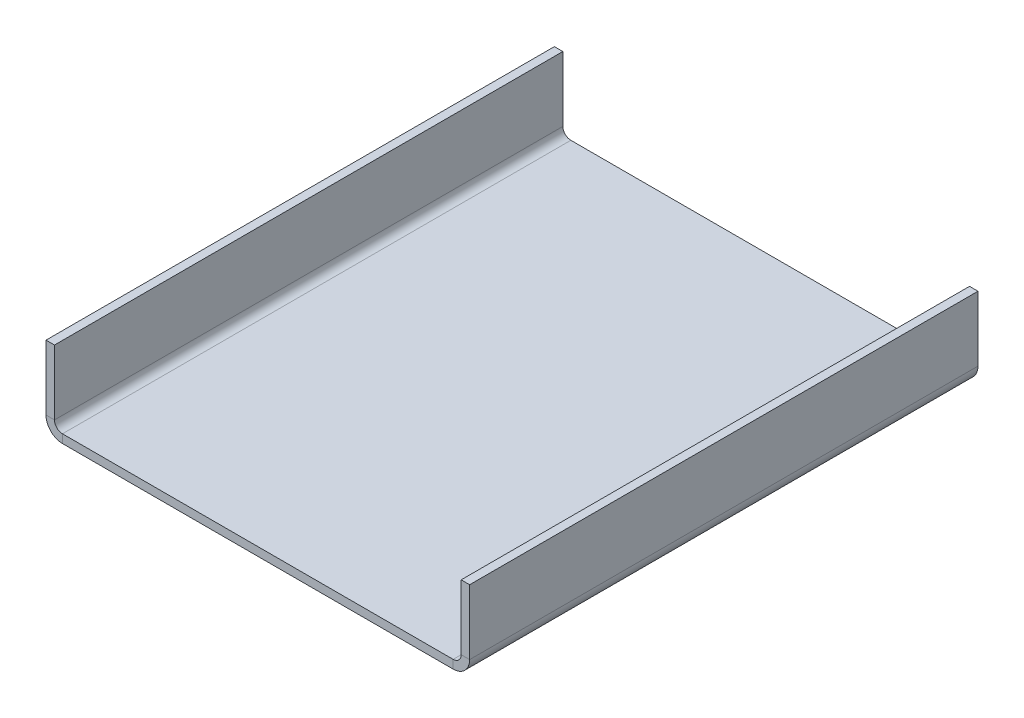
ISO-10303-21;
HEADER;
FILE_DESCRIPTION(('STEP AP214'),'2;1');
FILE_NAME('part.step','',(''),(''),'','','');
FILE_SCHEMA(('AUTOMOTIVE_DESIGN { 1 0 10303 214 1 1 1 1 }'));
ENDSEC;
DATA;
#1=APPLICATION_CONTEXT('core data for automotive mechanical design processes');
#2=APPLICATION_PROTOCOL_DEFINITION('international standard','automotive_design',2000,#1);
#3=PRODUCT_CONTEXT('',#1,'mechanical');
#4=PRODUCT('Part','Part','',(#3));
#5=PRODUCT_RELATED_PRODUCT_CATEGORY('part','',(#4));
#6=PRODUCT_DEFINITION_FORMATION('','',#4);
#7=PRODUCT_DEFINITION_CONTEXT('part definition',#1,'design');
#8=PRODUCT_DEFINITION('design','',#6,#7);
#9=PRODUCT_DEFINITION_SHAPE('','',#8);
#10=(LENGTH_UNIT() NAMED_UNIT(*) SI_UNIT(.MILLI.,.METRE.));
#11=(NAMED_UNIT(*) PLANE_ANGLE_UNIT() SI_UNIT($,.RADIAN.));
#12=(NAMED_UNIT(*) SI_UNIT($,.STERADIAN.) SOLID_ANGLE_UNIT());
#13=UNCERTAINTY_MEASURE_WITH_UNIT(LENGTH_MEASURE(1.E-05),#10,'distance_accuracy_value','');
#14=(GEOMETRIC_REPRESENTATION_CONTEXT(3) GLOBAL_UNCERTAINTY_ASSIGNED_CONTEXT((#13)) GLOBAL_UNIT_ASSIGNED_CONTEXT((#10,
#11,#12)) REPRESENTATION_CONTEXT('',''));
#15=CARTESIAN_POINT('',(0.,0.,0.));
#16=DIRECTION('',(0.,0.,1.));
#17=DIRECTION('',(1.,0.,0.));
#18=AXIS2_PLACEMENT_3D('',#15,#16,#17);
#19=CARTESIAN_POINT('',(-79.375,-9.06500000000001,190.5));
#20=DIRECTION('',(0.,0.,1.));
#21=DIRECTION('',(1.,0.,0.));
#22=AXIS2_PLACEMENT_3D('',#19,#20,#21);
#23=PLANE('',#22);
#24=DIRECTION('',(1.,0.,0.));
#25=VECTOR('',#24,1.);
#26=CARTESIAN_POINT('',(-79.375,-9.06500000000001,190.5));
#27=LINE('',#26,#25);
#28=CARTESIAN_POINT('',(-79.375,-9.06500000000001,190.5));
#29=VERTEX_POINT('',#28);
#30=CARTESIAN_POINT('',(-76.2,-9.06500000000001,190.5));
#31=VERTEX_POINT('',#30);
#32=EDGE_CURVE('E11',#29,#31,#27,.T.);
#33=ORIENTED_EDGE('',*,*,#32,.F.);
#34=CARTESIAN_POINT('',(-73.2,-9.06500000000001,190.5));
#35=DIRECTION('',(0.,0.,-1.));
#36=DIRECTION('',(-1.,0.,0.));
#37=AXIS2_PLACEMENT_3D('',#34,#35,#36);
#38=CIRCLE('',#37,6.175);
#39=CARTESIAN_POINT('',(-73.1999999999999,-15.24,190.5));
#40=VERTEX_POINT('',#39);
#41=EDGE_CURVE('E146',#29,#40,#38,.F.);
#42=ORIENTED_EDGE('',*,*,#41,.T.);
#43=DIRECTION('',(0.,-1.,0.));
#44=VECTOR('',#43,1.);
#45=CARTESIAN_POINT('',(-73.1999999999999,-12.065,190.5));
#46=LINE('',#45,#44);
#47=CARTESIAN_POINT('',(-73.1999999999999,-12.065,190.5));
#48=VERTEX_POINT('',#47);
#49=EDGE_CURVE('E44',#48,#40,#46,.T.);
#50=ORIENTED_EDGE('',*,*,#49,.F.);
#51=CARTESIAN_POINT('',(-73.2,-9.06500000000001,190.5));
#52=DIRECTION('',(0.,0.,1.));
#53=DIRECTION('',(1.,0.,0.));
#54=AXIS2_PLACEMENT_3D('',#51,#52,#53);
#55=CIRCLE('',#54,3.);
#56=EDGE_CURVE('E240',#31,#48,#55,.T.);
#57=ORIENTED_EDGE('',*,*,#56,.F.);
#58=EDGE_LOOP('',(#33,#42,#50,#57));
#59=FACE_BOUND('',#58,.T.);
#60=ADVANCED_FACE('F36',(#59),#23,.T.);
#61=CARTESIAN_POINT('',(-73.1999999999999,-12.065,190.5));
#62=DIRECTION('',(0.,0.,1.));
#63=DIRECTION('',(1.,0.,0.));
#64=AXIS2_PLACEMENT_3D('',#61,#62,#63);
#65=PLANE('',#64);
#66=DIRECTION('',(0.,-1.,0.));
#67=VECTOR('',#66,1.);
#68=CARTESIAN_POINT('',(-79.375,-15.24,190.5));
#69=LINE('',#68,#67);
#70=CARTESIAN_POINT('',(-79.375,15.24,190.5));
#71=VERTEX_POINT('',#70);
#72=EDGE_CURVE('E151',#71,#29,#69,.T.);
#73=ORIENTED_EDGE('',*,*,#72,.T.);
#74=ORIENTED_EDGE('',*,*,#32,.T.);
#75=DIRECTION('',(0.,1.,0.));
#76=VECTOR('',#75,1.);
#77=CARTESIAN_POINT('',(-76.2,-15.24,190.5));
#78=LINE('',#77,#76);
#79=CARTESIAN_POINT('',(-76.2,15.24,190.5));
#80=VERTEX_POINT('',#79);
#81=EDGE_CURVE('E253',#80,#31,#78,.F.);
#82=ORIENTED_EDGE('',*,*,#81,.F.);
#83=DIRECTION('',(1.,0.,0.));
#84=VECTOR('',#83,1.);
#85=CARTESIAN_POINT('',(-79.375,15.24,190.5));
#86=LINE('',#85,#84);
#87=EDGE_CURVE('E255',#71,#80,#86,.T.);
#88=ORIENTED_EDGE('',*,*,#87,.F.);
#89=EDGE_LOOP('',(#73,#74,#82,#88));
#90=FACE_BOUND('',#89,.T.);
#91=ADVANCED_FACE('F266',(#90),#65,.T.);
#92=CARTESIAN_POINT('',(-73.1999999999999,-15.24,0.));
#93=DIRECTION('',(0.,0.,-1.));
#94=DIRECTION('',(-1.,0.,0.));
#95=AXIS2_PLACEMENT_3D('',#92,#93,#94);
#96=PLANE('',#95);
#97=DIRECTION('',(0.,1.,0.));
#98=VECTOR('',#97,1.);
#99=CARTESIAN_POINT('',(-73.1999999999999,-15.24,0.));
#100=LINE('',#99,#98);
#101=CARTESIAN_POINT('',(-73.1999999999999,-15.24,0.));
#102=VERTEX_POINT('',#101);
#103=CARTESIAN_POINT('',(-73.1999999999999,-12.065,0.));
#104=VERTEX_POINT('',#103);
#105=EDGE_CURVE('E144',#102,#104,#100,.T.);
#106=ORIENTED_EDGE('',*,*,#105,.F.);
#107=CARTESIAN_POINT('',(-73.2,-9.06500000000001,0.));
#108=DIRECTION('',(0.,0.,-1.));
#109=DIRECTION('',(-1.,0.,0.));
#110=AXIS2_PLACEMENT_3D('',#107,#108,#109);
#111=CIRCLE('',#110,6.175);
#112=CARTESIAN_POINT('',(-79.375,-9.06500000000001,0.));
#113=VERTEX_POINT('',#112);
#114=EDGE_CURVE('E158',#113,#102,#111,.F.);
#115=ORIENTED_EDGE('',*,*,#114,.F.);
#116=DIRECTION('',(-1.,0.,0.));
#117=VECTOR('',#116,1.);
#118=CARTESIAN_POINT('',(-76.2,-9.06500000000001,0.));
#119=LINE('',#118,#117);
#120=CARTESIAN_POINT('',(-76.2,-9.06500000000001,0.));
#121=VERTEX_POINT('',#120);
#122=EDGE_CURVE('E231',#121,#113,#119,.T.);
#123=ORIENTED_EDGE('',*,*,#122,.F.);
#124=CARTESIAN_POINT('',(-73.2,-9.06500000000001,0.));
#125=DIRECTION('',(0.,0.,1.));
#126=DIRECTION('',(1.,0.,0.));
#127=AXIS2_PLACEMENT_3D('',#124,#125,#126);
#128=CIRCLE('',#127,3.);
#129=EDGE_CURVE('E185',#121,#104,#128,.T.);
#130=ORIENTED_EDGE('',*,*,#129,.T.);
#131=EDGE_LOOP('',(#106,#115,#123,#130));
#132=FACE_BOUND('',#131,.T.);
#133=ADVANCED_FACE('F245',(#132),#96,.T.);
#134=CARTESIAN_POINT('',(-76.2,-9.06500000000001,0.));
#135=DIRECTION('',(0.,0.,-1.));
#136=DIRECTION('',(-1.,0.,0.));
#137=AXIS2_PLACEMENT_3D('',#134,#135,#136);
#138=PLANE('',#137);
#139=DIRECTION('',(1.,0.,0.));
#140=VECTOR('',#139,1.);
#141=CARTESIAN_POINT('',(79.375,-15.24,0.));
#142=LINE('',#141,#140);
#143=CARTESIAN_POINT('',(73.2,-15.24,0.));
#144=VERTEX_POINT('',#143);
#145=EDGE_CURVE('E198',#102,#144,#142,.T.);
#146=ORIENTED_EDGE('',*,*,#145,.F.);
#147=ORIENTED_EDGE('',*,*,#105,.T.);
#148=DIRECTION('',(1.,0.,0.));
#149=VECTOR('',#148,1.);
#150=CARTESIAN_POINT('',(79.375,-12.065,0.));
#151=LINE('',#150,#149);
#152=CARTESIAN_POINT('',(73.2,-12.065,0.));
#153=VERTEX_POINT('',#152);
#154=EDGE_CURVE('E183',#104,#153,#151,.T.);
#155=ORIENTED_EDGE('',*,*,#154,.T.);
#156=DIRECTION('',(0.,-1.,0.));
#157=VECTOR('',#156,1.);
#158=CARTESIAN_POINT('',(73.2,-12.065,0.));
#159=LINE('',#158,#157);
#160=EDGE_CURVE('E93',#153,#144,#159,.T.);
#161=ORIENTED_EDGE('',*,*,#160,.T.);
#162=EDGE_LOOP('',(#146,#147,#155,#161));
#163=FACE_BOUND('',#162,.T.);
#164=ADVANCED_FACE('F233',(#163),#138,.T.);
#165=CARTESIAN_POINT('',(73.2,-15.24,190.5));
#166=DIRECTION('',(0.,0.,1.));
#167=DIRECTION('',(1.,0.,0.));
#168=AXIS2_PLACEMENT_3D('',#165,#166,#167);
#169=PLANE('',#168);
#170=DIRECTION('',(0.,1.,0.));
#171=VECTOR('',#170,1.);
#172=CARTESIAN_POINT('',(73.2,-15.24,190.5));
#173=LINE('',#172,#171);
#174=CARTESIAN_POINT('',(73.2,-15.24,190.5));
#175=VERTEX_POINT('',#174);
#176=CARTESIAN_POINT('',(73.2,-12.065,190.5));
#177=VERTEX_POINT('',#176);
#178=EDGE_CURVE('E229',#175,#177,#173,.T.);
#179=ORIENTED_EDGE('',*,*,#178,.F.);
#180=CARTESIAN_POINT('',(73.2,-9.06499999999999,190.5));
#181=DIRECTION('',(0.,0.,-1.));
#182=DIRECTION('',(-1.,0.,0.));
#183=AXIS2_PLACEMENT_3D('',#180,#181,#182);
#184=CIRCLE('',#183,6.175);
#185=CARTESIAN_POINT('',(79.375,-9.06499999999999,190.5));
#186=VERTEX_POINT('',#185);
#187=EDGE_CURVE('E166',#175,#186,#184,.F.);
#188=ORIENTED_EDGE('',*,*,#187,.T.);
#189=DIRECTION('',(1.,0.,0.));
#190=VECTOR('',#189,1.);
#191=CARTESIAN_POINT('',(76.2,-9.06499999999999,190.5));
#192=LINE('',#191,#190);
#193=CARTESIAN_POINT('',(76.2,-9.06499999999999,190.5));
#194=VERTEX_POINT('',#193);
#195=EDGE_CURVE('E52',#194,#186,#192,.T.);
#196=ORIENTED_EDGE('',*,*,#195,.F.);
#197=CARTESIAN_POINT('',(73.2,-9.06499999999999,190.5));
#198=DIRECTION('',(0.,0.,1.));
#199=DIRECTION('',(1.,0.,0.));
#200=AXIS2_PLACEMENT_3D('',#197,#198,#199);
#201=CIRCLE('',#200,3.);
#202=EDGE_CURVE('E257',#177,#194,#201,.T.);
#203=ORIENTED_EDGE('',*,*,#202,.F.);
#204=EDGE_LOOP('',(#179,#188,#196,#203));
#205=FACE_BOUND('',#204,.T.);
#206=ADVANCED_FACE('F292',(#205),#169,.T.);
#207=CARTESIAN_POINT('',(76.2,-9.06499999999999,190.5));
#208=DIRECTION('',(0.,0.,1.));
#209=DIRECTION('',(1.,0.,0.));
#210=AXIS2_PLACEMENT_3D('',#207,#208,#209);
#211=PLANE('',#210);
#212=DIRECTION('',(1.,0.,0.));
#213=VECTOR('',#212,1.);
#214=CARTESIAN_POINT('',(79.375,-15.24,190.5));
#215=LINE('',#214,#213);
#216=EDGE_CURVE('E136',#40,#175,#215,.T.);
#217=ORIENTED_EDGE('',*,*,#216,.T.);
#218=ORIENTED_EDGE('',*,*,#178,.T.);
#219=DIRECTION('',(1.,0.,0.));
#220=VECTOR('',#219,1.);
#221=CARTESIAN_POINT('',(79.375,-12.065,190.5));
#222=LINE('',#221,#220);
#223=EDGE_CURVE('E139',#48,#177,#222,.T.);
#224=ORIENTED_EDGE('',*,*,#223,.F.);
#225=ORIENTED_EDGE('',*,*,#49,.T.);
#226=EDGE_LOOP('',(#217,#218,#224,#225));
#227=FACE_BOUND('',#226,.T.);
#228=ADVANCED_FACE('F134',(#227),#211,.T.);
#229=CARTESIAN_POINT('',(79.375,-9.06499999999999,0.));
#230=DIRECTION('',(0.,0.,-1.));
#231=DIRECTION('',(-1.,0.,0.));
#232=AXIS2_PLACEMENT_3D('',#229,#230,#231);
#233=PLANE('',#232);
#234=DIRECTION('',(-1.,0.,0.));
#235=VECTOR('',#234,1.);
#236=CARTESIAN_POINT('',(79.375,-9.06499999999999,0.));
#237=LINE('',#236,#235);
#238=CARTESIAN_POINT('',(79.375,-9.06499999999999,0.));
#239=VERTEX_POINT('',#238);
#240=CARTESIAN_POINT('',(76.2,-9.06499999999999,0.));
#241=VERTEX_POINT('',#240);
#242=EDGE_CURVE('E100',#239,#241,#237,.T.);
#243=ORIENTED_EDGE('',*,*,#242,.F.);
#244=CARTESIAN_POINT('',(73.2,-9.06499999999999,0.));
#245=DIRECTION('',(0.,0.,-1.));
#246=DIRECTION('',(-1.,0.,0.));
#247=AXIS2_PLACEMENT_3D('',#244,#245,#246);
#248=CIRCLE('',#247,6.175);
#249=EDGE_CURVE('E200',#144,#239,#248,.F.);
#250=ORIENTED_EDGE('',*,*,#249,.F.);
#251=ORIENTED_EDGE('',*,*,#160,.F.);
#252=CARTESIAN_POINT('',(73.2,-9.06499999999999,0.));
#253=DIRECTION('',(0.,0.,1.));
#254=DIRECTION('',(1.,0.,0.));
#255=AXIS2_PLACEMENT_3D('',#252,#253,#254);
#256=CIRCLE('',#255,3.);
#257=EDGE_CURVE('E181',#153,#241,#256,.T.);
#258=ORIENTED_EDGE('',*,*,#257,.T.);
#259=EDGE_LOOP('',(#243,#250,#251,#258));
#260=FACE_BOUND('',#259,.T.);
#261=ADVANCED_FACE('F298',(#260),#233,.T.);
#262=CARTESIAN_POINT('',(73.2,-12.065,0.));
#263=DIRECTION('',(0.,0.,-1.));
#264=DIRECTION('',(-1.,0.,0.));
#265=AXIS2_PLACEMENT_3D('',#262,#263,#264);
#266=PLANE('',#265);
#267=DIRECTION('',(0.,1.,0.));
#268=VECTOR('',#267,1.);
#269=CARTESIAN_POINT('',(79.375,-15.24,0.));
#270=LINE('',#269,#268);
#271=CARTESIAN_POINT('',(79.375,15.24,0.));
#272=VERTEX_POINT('',#271);
#273=EDGE_CURVE('E172',#239,#272,#270,.T.);
#274=ORIENTED_EDGE('',*,*,#273,.F.);
#275=ORIENTED_EDGE('',*,*,#242,.T.);
#276=DIRECTION('',(0.,1.,0.));
#277=VECTOR('',#276,1.);
#278=CARTESIAN_POINT('',(76.2,-15.24,0.));
#279=LINE('',#278,#277);
#280=CARTESIAN_POINT('',(76.2,15.24,0.));
#281=VERTEX_POINT('',#280);
#282=EDGE_CURVE('E178',#241,#281,#279,.T.);
#283=ORIENTED_EDGE('',*,*,#282,.T.);
#284=DIRECTION('',(1.,0.,0.));
#285=VECTOR('',#284,1.);
#286=CARTESIAN_POINT('',(76.2,15.24,0.));
#287=LINE('',#286,#285);
#288=EDGE_CURVE('E175',#281,#272,#287,.T.);
#289=ORIENTED_EDGE('',*,*,#288,.T.);
#290=EDGE_LOOP('',(#274,#275,#283,#289));
#291=FACE_BOUND('',#290,.T.);
#292=ADVANCED_FACE('F301',(#291),#266,.T.);
#293=CARTESIAN_POINT('',(79.375,-15.24,190.5));
#294=DIRECTION('',(-1.,0.,0.));
#295=DIRECTION('',(0.,0.,1.));
#296=AXIS2_PLACEMENT_3D('',#293,#294,#295);
#297=PLANE('',#296);
#298=ORIENTED_EDGE('',*,*,#273,.T.);
#299=DIRECTION('',(0.,0.,-1.));
#300=VECTOR('',#299,1.);
#301=CARTESIAN_POINT('',(79.375,15.24,190.5));
#302=LINE('',#301,#300);
#303=CARTESIAN_POINT('',(79.375,15.24,190.5));
#304=VERTEX_POINT('',#303);
#305=EDGE_CURVE('E224',#304,#272,#302,.T.);
#306=ORIENTED_EDGE('',*,*,#305,.F.);
#307=DIRECTION('',(0.,1.,0.));
#308=VECTOR('',#307,1.);
#309=CARTESIAN_POINT('',(79.375,-15.24,190.5));
#310=LINE('',#309,#308);
#311=EDGE_CURVE('E106',#186,#304,#310,.T.);
#312=ORIENTED_EDGE('',*,*,#311,.F.);
#313=DIRECTION('',(0.,0.,-1.));
#314=VECTOR('',#313,1.);
#315=CARTESIAN_POINT('',(79.375,-9.06499999999999,190.5));
#316=LINE('',#315,#314);
#317=EDGE_CURVE('E168',#186,#239,#316,.T.);
#318=ORIENTED_EDGE('',*,*,#317,.T.);
#319=EDGE_LOOP('',(#298,#306,#312,#318));
#320=FACE_BOUND('',#319,.T.);
#321=ADVANCED_FACE('F304',(#320),#297,.F.);
#322=CARTESIAN_POINT('',(76.2,15.24,190.5));
#323=DIRECTION('',(0.,1.,0.));
#324=DIRECTION('',(0.,0.,1.));
#325=AXIS2_PLACEMENT_3D('',#322,#323,#324);
#326=PLANE('',#325);
#327=ORIENTED_EDGE('',*,*,#288,.F.);
#328=DIRECTION('',(0.,0.,-1.));
#329=VECTOR('',#328,1.);
#330=CARTESIAN_POINT('',(76.2,15.24,190.5));
#331=LINE('',#330,#329);
#332=CARTESIAN_POINT('',(76.2,15.24,190.5));
#333=VERTEX_POINT('',#332);
#334=EDGE_CURVE('E222',#333,#281,#331,.T.);
#335=ORIENTED_EDGE('',*,*,#334,.F.);
#336=DIRECTION('',(1.,0.,0.));
#337=VECTOR('',#336,1.);
#338=CARTESIAN_POINT('',(76.2,15.24,190.5));
#339=LINE('',#338,#337);
#340=EDGE_CURVE('E512',#333,#304,#339,.T.);
#341=ORIENTED_EDGE('',*,*,#340,.T.);
#342=ORIENTED_EDGE('',*,*,#305,.T.);
#343=EDGE_LOOP('',(#327,#335,#341,#342));
#344=FACE_BOUND('',#343,.T.);
#345=ADVANCED_FACE('F308',(#344),#326,.T.);
#346=CARTESIAN_POINT('',(76.2,-15.24,190.5));
#347=DIRECTION('',(-1.,0.,0.));
#348=DIRECTION('',(0.,0.,1.));
#349=AXIS2_PLACEMENT_3D('',#346,#347,#348);
#350=PLANE('',#349);
#351=ORIENTED_EDGE('',*,*,#282,.F.);
#352=DIRECTION('',(0.,0.,-1.));
#353=VECTOR('',#352,1.);
#354=CARTESIAN_POINT('',(76.2,-9.06499999999999,190.5));
#355=LINE('',#354,#353);
#356=EDGE_CURVE('E219',#194,#241,#355,.T.);
#357=ORIENTED_EDGE('',*,*,#356,.F.);
#358=DIRECTION('',(0.,1.,0.));
#359=VECTOR('',#358,1.);
#360=CARTESIAN_POINT('',(76.2,-15.24,190.5));
#361=LINE('',#360,#359);
#362=EDGE_CURVE('E514',#194,#333,#361,.T.);
#363=ORIENTED_EDGE('',*,*,#362,.T.);
#364=ORIENTED_EDGE('',*,*,#334,.T.);
#365=EDGE_LOOP('',(#351,#357,#363,#364));
#366=FACE_BOUND('',#365,.T.);
#367=ADVANCED_FACE('F312',(#366),#350,.T.);
#368=CARTESIAN_POINT('',(73.2,-9.06499999999999,190.5));
#369=DIRECTION('',(0.,0.,-1.));
#370=DIRECTION('',(-1.,0.,0.));
#371=AXIS2_PLACEMENT_3D('',#368,#369,#370);
#372=CYLINDRICAL_SURFACE('',#371,3.);
#373=ORIENTED_EDGE('',*,*,#257,.F.);
#374=DIRECTION('',(0.,0.,-1.));
#375=VECTOR('',#374,1.);
#376=CARTESIAN_POINT('',(73.2,-12.065,190.5));
#377=LINE('',#376,#375);
#378=EDGE_CURVE('E216',#177,#153,#377,.T.);
#379=ORIENTED_EDGE('',*,*,#378,.F.);
#380=ORIENTED_EDGE('',*,*,#202,.T.);
#381=ORIENTED_EDGE('',*,*,#356,.T.);
#382=EDGE_LOOP('',(#373,#379,#380,#381));
#383=FACE_BOUND('',#382,.T.);
#384=ADVANCED_FACE('F316',(#383),#372,.F.);
#385=CARTESIAN_POINT('',(79.375,-12.065,190.5));
#386=DIRECTION('',(0.,1.,0.));
#387=DIRECTION('',(-1.,0.,0.));
#388=AXIS2_PLACEMENT_3D('',#385,#386,#387);
#389=PLANE('',#388);
#390=ORIENTED_EDGE('',*,*,#154,.F.);
#391=DIRECTION('',(0.,0.,-1.));
#392=VECTOR('',#391,1.);
#393=CARTESIAN_POINT('',(-73.1999999999999,-12.065,190.5));
#394=LINE('',#393,#392);
#395=EDGE_CURVE('E213',#48,#104,#394,.T.);
#396=ORIENTED_EDGE('',*,*,#395,.F.);
#397=ORIENTED_EDGE('',*,*,#223,.T.);
#398=ORIENTED_EDGE('',*,*,#378,.T.);
#399=EDGE_LOOP('',(#390,#396,#397,#398));
#400=FACE_BOUND('',#399,.T.);
#401=ADVANCED_FACE('F242',(#400),#389,.T.);
#402=CARTESIAN_POINT('',(-73.2,-9.06500000000001,190.5));
#403=DIRECTION('',(0.,0.,-1.));
#404=DIRECTION('',(-1.,0.,0.));
#405=AXIS2_PLACEMENT_3D('',#402,#403,#404);
#406=CYLINDRICAL_SURFACE('',#405,3.);
#407=ORIENTED_EDGE('',*,*,#129,.F.);
#408=DIRECTION('',(0.,0.,-1.));
#409=VECTOR('',#408,1.);
#410=CARTESIAN_POINT('',(-76.2,-9.06500000000001,190.5));
#411=LINE('',#410,#409);
#412=EDGE_CURVE('E210',#31,#121,#411,.T.);
#413=ORIENTED_EDGE('',*,*,#412,.F.);
#414=ORIENTED_EDGE('',*,*,#56,.T.);
#415=ORIENTED_EDGE('',*,*,#395,.T.);
#416=EDGE_LOOP('',(#407,#413,#414,#415));
#417=FACE_BOUND('',#416,.T.);
#418=ADVANCED_FACE('F238',(#417),#406,.F.);
#419=CARTESIAN_POINT('',(-76.2,-15.24,190.5));
#420=DIRECTION('',(1.,0.,0.));
#421=DIRECTION('',(0.,0.,-1.));
#422=AXIS2_PLACEMENT_3D('',#419,#420,#421);
#423=PLANE('',#422);
#424=DIRECTION('',(0.,1.,0.));
#425=VECTOR('',#424,1.);
#426=CARTESIAN_POINT('',(-76.2,-15.24,0.));
#427=LINE('',#426,#425);
#428=CARTESIAN_POINT('',(-76.2,15.24,0.));
#429=VERTEX_POINT('',#428);
#430=EDGE_CURVE('E188',#429,#121,#427,.F.);
#431=ORIENTED_EDGE('',*,*,#430,.F.);
#432=DIRECTION('',(0.,0.,-1.));
#433=VECTOR('',#432,1.);
#434=CARTESIAN_POINT('',(-76.2,15.24,190.5));
#435=LINE('',#434,#433);
#436=EDGE_CURVE('E208',#80,#429,#435,.T.);
#437=ORIENTED_EDGE('',*,*,#436,.F.);
#438=ORIENTED_EDGE('',*,*,#81,.T.);
#439=ORIENTED_EDGE('',*,*,#412,.T.);
#440=EDGE_LOOP('',(#431,#437,#438,#439));
#441=FACE_BOUND('',#440,.T.);
#442=ADVANCED_FACE('F251',(#441),#423,.T.);
#443=CARTESIAN_POINT('',(-79.375,15.24,190.5));
#444=DIRECTION('',(0.,1.,0.));
#445=DIRECTION('',(0.,0.,1.));
#446=AXIS2_PLACEMENT_3D('',#443,#444,#445);
#447=PLANE('',#446);
#448=DIRECTION('',(1.,0.,0.));
#449=VECTOR('',#448,1.);
#450=CARTESIAN_POINT('',(-79.375,15.24,0.));
#451=LINE('',#450,#449);
#452=CARTESIAN_POINT('',(-79.375,15.24,0.));
#453=VERTEX_POINT('',#452);
#454=EDGE_CURVE('E191',#453,#429,#451,.T.);
#455=ORIENTED_EDGE('',*,*,#454,.F.);
#456=DIRECTION('',(0.,0.,-1.));
#457=VECTOR('',#456,1.);
#458=CARTESIAN_POINT('',(-79.375,15.24,190.5));
#459=LINE('',#458,#457);
#460=EDGE_CURVE('E206',#71,#453,#459,.T.);
#461=ORIENTED_EDGE('',*,*,#460,.F.);
#462=ORIENTED_EDGE('',*,*,#87,.T.);
#463=ORIENTED_EDGE('',*,*,#436,.T.);
#464=EDGE_LOOP('',(#455,#461,#462,#463));
#465=FACE_BOUND('',#464,.T.);
#466=ADVANCED_FACE('F272',(#465),#447,.T.);
#467=CARTESIAN_POINT('',(-79.375,-15.24,190.5));
#468=DIRECTION('',(1.,0.,0.));
#469=DIRECTION('',(0.,0.,-1.));
#470=AXIS2_PLACEMENT_3D('',#467,#468,#469);
#471=PLANE('',#470);
#472=DIRECTION('',(0.,-1.,0.));
#473=VECTOR('',#472,1.);
#474=CARTESIAN_POINT('',(-79.375,-15.24,0.));
#475=LINE('',#474,#473);
#476=EDGE_CURVE('E194',#453,#113,#475,.T.);
#477=ORIENTED_EDGE('',*,*,#476,.T.);
#478=DIRECTION('',(0.,0.,-1.));
#479=VECTOR('',#478,1.);
#480=CARTESIAN_POINT('',(-79.375,-9.06500000000001,190.5));
#481=LINE('',#480,#479);
#482=EDGE_CURVE('E160',#29,#113,#481,.T.);
#483=ORIENTED_EDGE('',*,*,#482,.F.);
#484=ORIENTED_EDGE('',*,*,#72,.F.);
#485=ORIENTED_EDGE('',*,*,#460,.T.);
#486=EDGE_LOOP('',(#477,#483,#484,#485));
#487=FACE_BOUND('',#486,.T.);
#488=ADVANCED_FACE('F268',(#487),#471,.F.);
#489=CARTESIAN_POINT('',(-73.2,-9.06500000000001,190.5));
#490=DIRECTION('',(0.,0.,-1.));
#491=DIRECTION('',(-1.,0.,0.));
#492=AXIS2_PLACEMENT_3D('',#489,#490,#491);
#493=CYLINDRICAL_SURFACE('',#492,6.175);
#494=ORIENTED_EDGE('',*,*,#114,.T.);
#495=DIRECTION('',(0.,0.,-1.));
#496=VECTOR('',#495,1.);
#497=CARTESIAN_POINT('',(-73.1999999999999,-15.24,190.5));
#498=LINE('',#497,#496);
#499=EDGE_CURVE('E155',#40,#102,#498,.T.);
#500=ORIENTED_EDGE('',*,*,#499,.F.);
#501=ORIENTED_EDGE('',*,*,#41,.F.);
#502=ORIENTED_EDGE('',*,*,#482,.T.);
#503=EDGE_LOOP('',(#494,#500,#501,#502));
#504=FACE_BOUND('',#503,.T.);
#505=ADVANCED_FACE('F156',(#504),#493,.T.);
#506=CARTESIAN_POINT('',(79.375,-15.24,190.5));
#507=DIRECTION('',(0.,1.,0.));
#508=DIRECTION('',(-1.,0.,0.));
#509=AXIS2_PLACEMENT_3D('',#506,#507,#508);
#510=PLANE('',#509);
#511=ORIENTED_EDGE('',*,*,#145,.T.);
#512=DIRECTION('',(0.,0.,-1.));
#513=VECTOR('',#512,1.);
#514=CARTESIAN_POINT('',(73.2,-15.24,190.5));
#515=LINE('',#514,#513);
#516=EDGE_CURVE('E161',#175,#144,#515,.T.);
#517=ORIENTED_EDGE('',*,*,#516,.F.);
#518=ORIENTED_EDGE('',*,*,#216,.F.);
#519=ORIENTED_EDGE('',*,*,#499,.T.);
#520=EDGE_LOOP('',(#511,#517,#518,#519));
#521=FACE_BOUND('',#520,.T.);
#522=ADVANCED_FACE('F163',(#521),#510,.F.);
#523=CARTESIAN_POINT('',(73.2,-9.06499999999999,190.5));
#524=DIRECTION('',(0.,0.,-1.));
#525=DIRECTION('',(-1.,0.,0.));
#526=AXIS2_PLACEMENT_3D('',#523,#524,#525);
#527=CYLINDRICAL_SURFACE('',#526,6.175);
#528=ORIENTED_EDGE('',*,*,#249,.T.);
#529=ORIENTED_EDGE('',*,*,#317,.F.);
#530=ORIENTED_EDGE('',*,*,#187,.F.);
#531=ORIENTED_EDGE('',*,*,#516,.T.);
#532=EDGE_LOOP('',(#528,#529,#530,#531));
#533=FACE_BOUND('',#532,.T.);
#534=ADVANCED_FACE('F363',(#533),#527,.T.);
#535=CARTESIAN_POINT('',(73.2,-9.06499999999999,190.5));
#536=DIRECTION('',(0.,0.,1.));
#537=DIRECTION('',(1.,0.,0.));
#538=AXIS2_PLACEMENT_3D('',#535,#536,#537);
#539=PLANE('',#538);
#540=ORIENTED_EDGE('',*,*,#311,.T.);
#541=ORIENTED_EDGE('',*,*,#340,.F.);
#542=ORIENTED_EDGE('',*,*,#362,.F.);
#543=ORIENTED_EDGE('',*,*,#195,.T.);
#544=EDGE_LOOP('',(#540,#541,#542,#543));
#545=FACE_BOUND('',#544,.T.);
#546=ADVANCED_FACE('F373',(#545),#539,.T.);
#547=CARTESIAN_POINT('',(73.2,-9.06499999999999,0.));
#548=DIRECTION('',(0.,0.,1.));
#549=DIRECTION('',(1.,0.,0.));
#550=AXIS2_PLACEMENT_3D('',#547,#548,#549);
#551=PLANE('',#550);
#552=ORIENTED_EDGE('',*,*,#430,.T.);
#553=ORIENTED_EDGE('',*,*,#122,.T.);
#554=ORIENTED_EDGE('',*,*,#476,.F.);
#555=ORIENTED_EDGE('',*,*,#454,.T.);
#556=EDGE_LOOP('',(#552,#553,#554,#555));
#557=FACE_BOUND('',#556,.T.);
#558=ADVANCED_FACE('F270',(#557),#551,.F.);
#559=CLOSED_SHELL('',(#60,#91,#133,#164,#206,#228,#261,#292,#321,#345,#367,#384,#401,#418,#442,
#466,#488,#505,#522,#534,#546,#558));
#560=MANIFOLD_SOLID_BREP('B2',#559);
#561=ADVANCED_BREP_SHAPE_REPRESENTATION('',(#18,#560),#14);
#562=SHAPE_DEFINITION_REPRESENTATION(#9,#561);
ENDSEC;
END-ISO-10303-21;
